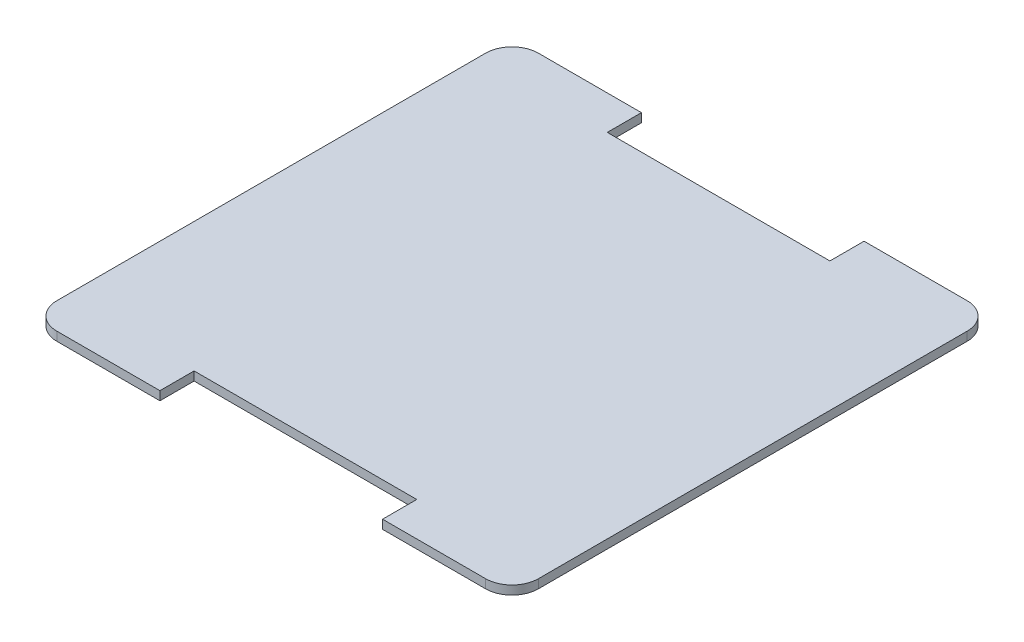
ISO-10303-21;
HEADER;
FILE_DESCRIPTION(('STEP AP214'),'2;1');
FILE_NAME('part.step','',(''),(''),'','','');
FILE_SCHEMA(('AUTOMOTIVE_DESIGN { 1 0 10303 214 1 1 1 1 }'));
ENDSEC;
DATA;
#1=APPLICATION_CONTEXT('core data for automotive mechanical design processes');
#2=APPLICATION_PROTOCOL_DEFINITION('international standard','automotive_design',2000,#1);
#3=PRODUCT_CONTEXT('',#1,'mechanical');
#4=PRODUCT('Part','Part','',(#3));
#5=PRODUCT_RELATED_PRODUCT_CATEGORY('part','',(#4));
#6=PRODUCT_DEFINITION_FORMATION('','',#4);
#7=PRODUCT_DEFINITION_CONTEXT('part definition',#1,'design');
#8=PRODUCT_DEFINITION('design','',#6,#7);
#9=PRODUCT_DEFINITION_SHAPE('','',#8);
#10=(LENGTH_UNIT() NAMED_UNIT(*) SI_UNIT(.MILLI.,.METRE.));
#11=(NAMED_UNIT(*) PLANE_ANGLE_UNIT() SI_UNIT($,.RADIAN.));
#12=(NAMED_UNIT(*) SI_UNIT($,.STERADIAN.) SOLID_ANGLE_UNIT());
#13=UNCERTAINTY_MEASURE_WITH_UNIT(LENGTH_MEASURE(1.E-05),#10,'distance_accuracy_value','');
#14=(GEOMETRIC_REPRESENTATION_CONTEXT(3) GLOBAL_UNCERTAINTY_ASSIGNED_CONTEXT((#13)) GLOBAL_UNIT_ASSIGNED_CONTEXT((#10,
#11,#12)) REPRESENTATION_CONTEXT('',''));
#15=CARTESIAN_POINT('',(0.,0.,0.));
#16=DIRECTION('',(0.,0.,1.));
#17=DIRECTION('',(1.,0.,0.));
#18=AXIS2_PLACEMENT_3D('',#15,#16,#17);
#19=CARTESIAN_POINT('',(-153.357036721238,58.7071385573017,452.9));
#20=DIRECTION('',(1.,0.,0.));
#21=DIRECTION('',(0.,0.,-1.));
#22=AXIS2_PLACEMENT_3D('',#19,#20,#21);
#23=PLANE('',#22);
#24=DIRECTION('',(0.,0.,1.));
#25=VECTOR('',#24,1.);
#26=CARTESIAN_POINT('',(-153.357036721238,50.7071385573017,452.9));
#27=LINE('',#26,#25);
#28=CARTESIAN_POINT('',(-153.357036721238,50.7071385573017,452.9));
#29=VERTEX_POINT('',#28);
#30=CARTESIAN_POINT('',(-153.357036721238,50.7071385573017,483.995534569727));
#31=VERTEX_POINT('',#30);
#32=EDGE_CURVE('E188',#29,#31,#27,.T.);
#33=ORIENTED_EDGE('',*,*,#32,.F.);
#34=DIRECTION('',(0.,-1.,0.));
#35=VECTOR('',#34,1.);
#36=CARTESIAN_POINT('',(-153.357036721238,58.7071385573017,452.9));
#37=LINE('',#36,#35);
#38=CARTESIAN_POINT('',(-153.357036721238,58.7071385573017,452.9));
#39=VERTEX_POINT('',#38);
#40=EDGE_CURVE('E11',#39,#29,#37,.T.);
#41=ORIENTED_EDGE('',*,*,#40,.F.);
#42=DIRECTION('',(0.,0.,1.));
#43=VECTOR('',#42,1.);
#44=CARTESIAN_POINT('',(-153.357036721238,58.7071385573017,452.9));
#45=LINE('',#44,#43);
#46=CARTESIAN_POINT('',(-153.357036721238,58.7071385573017,483.995534569727));
#47=VERTEX_POINT('',#46);
#48=EDGE_CURVE('E230',#39,#47,#45,.T.);
#49=ORIENTED_EDGE('',*,*,#48,.T.);
#50=DIRECTION('',(0.,-1.,0.));
#51=VECTOR('',#50,1.);
#52=CARTESIAN_POINT('',(-153.357036721238,58.7071385573017,483.995534569727));
#53=LINE('',#52,#51);
#54=EDGE_CURVE('E45',#47,#31,#53,.T.);
#55=ORIENTED_EDGE('',*,*,#54,.T.);
#56=EDGE_LOOP('',(#33,#41,#49,#55));
#57=FACE_BOUND('',#56,.T.);
#58=ADVANCED_FACE('F42',(#57),#23,.T.);
#59=CARTESIAN_POINT('',(-153.357036721238,58.7071385573017,452.9));
#60=DIRECTION('',(0.,0.,-1.));
#61=DIRECTION('',(-1.,0.,0.));
#62=AXIS2_PLACEMENT_3D('',#59,#60,#61);
#63=PLANE('',#62);
#64=DIRECTION('',(1.,0.,0.));
#65=VECTOR('',#64,1.);
#66=CARTESIAN_POINT('',(-153.357036721238,50.7071385573017,452.9));
#67=LINE('',#66,#65);
#68=CARTESIAN_POINT('',(49.1529632787621,50.7071385573017,452.9));
#69=VERTEX_POINT('',#68);
#70=EDGE_CURVE('E111',#29,#69,#67,.T.);
#71=ORIENTED_EDGE('',*,*,#70,.T.);
#72=DIRECTION('',(0.,-1.,0.));
#73=VECTOR('',#72,1.);
#74=CARTESIAN_POINT('',(49.1529632787621,58.7071385573017,452.9));
#75=LINE('',#74,#73);
#76=CARTESIAN_POINT('',(49.1529632787621,58.7071385573017,452.9));
#77=VERTEX_POINT('',#76);
#78=EDGE_CURVE('E51',#77,#69,#75,.T.);
#79=ORIENTED_EDGE('',*,*,#78,.F.);
#80=DIRECTION('',(1.,0.,0.));
#81=VECTOR('',#80,1.);
#82=CARTESIAN_POINT('',(-153.357036721238,58.7071385573017,452.9));
#83=LINE('',#82,#81);
#84=EDGE_CURVE('E166',#39,#77,#83,.T.);
#85=ORIENTED_EDGE('',*,*,#84,.F.);
#86=ORIENTED_EDGE('',*,*,#40,.T.);
#87=EDGE_LOOP('',(#71,#79,#85,#86));
#88=FACE_BOUND('',#87,.T.);
#89=ADVANCED_FACE('F341',(#88),#63,.F.);
#90=CARTESIAN_POINT('',(49.1529632787621,58.7071385573017,452.9));
#91=DIRECTION('',(1.,0.,0.));
#92=DIRECTION('',(0.,0.,-1.));
#93=AXIS2_PLACEMENT_3D('',#90,#91,#92);
#94=PLANE('',#93);
#95=DIRECTION('',(0.,0.,1.));
#96=VECTOR('',#95,1.);
#97=CARTESIAN_POINT('',(49.1529632787621,50.7071385573017,452.9));
#98=LINE('',#97,#96);
#99=CARTESIAN_POINT('',(49.1529632787622,50.7071385573017,483.995534569727));
#100=VERTEX_POINT('',#99);
#101=EDGE_CURVE('E173',#69,#100,#98,.T.);
#102=ORIENTED_EDGE('',*,*,#101,.T.);
#103=DIRECTION('',(0.,-1.,0.));
#104=VECTOR('',#103,1.);
#105=CARTESIAN_POINT('',(49.1529632787622,58.7071385573017,483.995534569727));
#106=LINE('',#105,#104);
#107=CARTESIAN_POINT('',(49.1529632787622,58.7071385573017,483.995534569727));
#108=VERTEX_POINT('',#107);
#109=EDGE_CURVE('E170',#108,#100,#106,.T.);
#110=ORIENTED_EDGE('',*,*,#109,.F.);
#111=DIRECTION('',(0.,0.,1.));
#112=VECTOR('',#111,1.);
#113=CARTESIAN_POINT('',(49.1529632787621,58.7071385573017,452.9));
#114=LINE('',#113,#112);
#115=EDGE_CURVE('E160',#77,#108,#114,.T.);
#116=ORIENTED_EDGE('',*,*,#115,.F.);
#117=ORIENTED_EDGE('',*,*,#78,.T.);
#118=EDGE_LOOP('',(#102,#110,#116,#117));
#119=FACE_BOUND('',#118,.T.);
#120=ADVANCED_FACE('F171',(#119),#94,.F.);
#121=CARTESIAN_POINT('',(142.897963278762,58.7071385573017,483.995534569727));
#122=DIRECTION('',(0.,0.,1.));
#123=DIRECTION('',(1.,0.,0.));
#124=AXIS2_PLACEMENT_3D('',#121,#122,#123);
#125=PLANE('',#124);
#126=DIRECTION('',(-1.,0.,0.));
#127=VECTOR('',#126,1.);
#128=CARTESIAN_POINT('',(142.897963278762,50.7071385573017,483.995534569727));
#129=LINE('',#128,#127);
#130=CARTESIAN_POINT('',(142.897963278762,50.7071385573017,483.995534569727));
#131=VERTEX_POINT('',#130);
#132=EDGE_CURVE('E227',#131,#100,#129,.T.);
#133=ORIENTED_EDGE('',*,*,#132,.F.);
#134=DIRECTION('',(0.,-1.,0.));
#135=VECTOR('',#134,1.);
#136=CARTESIAN_POINT('',(142.897963278762,58.7071385573017,483.995534569727));
#137=LINE('',#136,#135);
#138=CARTESIAN_POINT('',(142.897963278762,58.7071385573017,483.995534569727));
#139=VERTEX_POINT('',#138);
#140=EDGE_CURVE('E177',#139,#131,#137,.T.);
#141=ORIENTED_EDGE('',*,*,#140,.F.);
#142=DIRECTION('',(-1.,0.,0.));
#143=VECTOR('',#142,1.);
#144=CARTESIAN_POINT('',(142.897963278762,58.7071385573017,483.995534569727));
#145=LINE('',#144,#143);
#146=EDGE_CURVE('E165',#139,#108,#145,.T.);
#147=ORIENTED_EDGE('',*,*,#146,.T.);
#148=ORIENTED_EDGE('',*,*,#109,.T.);
#149=EDGE_LOOP('',(#133,#141,#147,#148));
#150=FACE_BOUND('',#149,.T.);
#151=ADVANCED_FACE('F179',(#150),#125,.T.);
#152=CARTESIAN_POINT('',(142.897963278762,58.7071385573017,460.));
#153=DIRECTION('',(0.,-1.,0.));
#154=DIRECTION('',(0.,0.,-1.));
#155=AXIS2_PLACEMENT_3D('',#152,#153,#154);
#156=CYLINDRICAL_SURFACE('',#155,23.9955345697272);
#157=CARTESIAN_POINT('',(142.897963278762,50.7071385573017,460.));
#158=DIRECTION('',(0.,1.,0.));
#159=DIRECTION('',(0.,0.,1.));
#160=AXIS2_PLACEMENT_3D('',#157,#158,#159);
#161=CIRCLE('',#160,23.9955345697272);
#162=CARTESIAN_POINT('',(166.893497848489,50.7071385573017,460.));
#163=VERTEX_POINT('',#162);
#164=EDGE_CURVE('E224',#131,#163,#161,.T.);
#165=ORIENTED_EDGE('',*,*,#164,.T.);
#166=DIRECTION('',(0.,-1.,0.));
#167=VECTOR('',#166,1.);
#168=CARTESIAN_POINT('',(166.893497848489,58.7071385573017,460.));
#169=LINE('',#168,#167);
#170=CARTESIAN_POINT('',(166.893497848489,58.7071385573017,460.));
#171=VERTEX_POINT('',#170);
#172=EDGE_CURVE('E234',#171,#163,#169,.T.);
#173=ORIENTED_EDGE('',*,*,#172,.F.);
#174=CARTESIAN_POINT('',(142.897963278762,58.7071385573017,460.));
#175=DIRECTION('',(0.,1.,0.));
#176=DIRECTION('',(0.,0.,1.));
#177=AXIS2_PLACEMENT_3D('',#174,#175,#176);
#178=CIRCLE('',#177,23.9955345697272);
#179=EDGE_CURVE('E181',#139,#171,#178,.T.);
#180=ORIENTED_EDGE('',*,*,#179,.F.);
#181=ORIENTED_EDGE('',*,*,#140,.T.);
#182=EDGE_LOOP('',(#165,#173,#180,#181));
#183=FACE_BOUND('',#182,.T.);
#184=ADVANCED_FACE('F264',(#183),#156,.T.);
#185=CARTESIAN_POINT('',(166.893497848489,58.7071385573017,70.));
#186=DIRECTION('',(1.,0.,0.));
#187=DIRECTION('',(0.,0.,-1.));
#188=AXIS2_PLACEMENT_3D('',#185,#186,#187);
#189=PLANE('',#188);
#190=DIRECTION('',(0.,0.,1.));
#191=VECTOR('',#190,1.);
#192=CARTESIAN_POINT('',(166.893497848489,50.7071385573017,70.));
#193=LINE('',#192,#191);
#194=CARTESIAN_POINT('',(166.893497848489,50.7071385573017,70.));
#195=VERTEX_POINT('',#194);
#196=EDGE_CURVE('E221',#195,#163,#193,.T.);
#197=ORIENTED_EDGE('',*,*,#196,.F.);
#198=DIRECTION('',(0.,-1.,0.));
#199=VECTOR('',#198,1.);
#200=CARTESIAN_POINT('',(166.893497848489,58.7071385573017,70.));
#201=LINE('',#200,#199);
#202=CARTESIAN_POINT('',(166.893497848489,58.7071385573017,70.));
#203=VERTEX_POINT('',#202);
#204=EDGE_CURVE('E236',#203,#195,#201,.T.);
#205=ORIENTED_EDGE('',*,*,#204,.F.);
#206=DIRECTION('',(0.,0.,1.));
#207=VECTOR('',#206,1.);
#208=CARTESIAN_POINT('',(166.893497848489,58.7071385573017,70.));
#209=LINE('',#208,#207);
#210=EDGE_CURVE('E183',#203,#171,#209,.T.);
#211=ORIENTED_EDGE('',*,*,#210,.T.);
#212=ORIENTED_EDGE('',*,*,#172,.T.);
#213=EDGE_LOOP('',(#197,#205,#211,#212));
#214=FACE_BOUND('',#213,.T.);
#215=ADVANCED_FACE('F331',(#214),#189,.T.);
#216=CARTESIAN_POINT('',(142.897963278762,58.7071385573017,70.));
#217=DIRECTION('',(0.,-1.,0.));
#218=DIRECTION('',(0.,0.,-1.));
#219=AXIS2_PLACEMENT_3D('',#216,#217,#218);
#220=CYLINDRICAL_SURFACE('',#219,23.9955345697272);
#221=CARTESIAN_POINT('',(142.897963278762,50.7071385573017,70.));
#222=DIRECTION('',(0.,1.,0.));
#223=DIRECTION('',(0.,0.,1.));
#224=AXIS2_PLACEMENT_3D('',#221,#222,#223);
#225=CIRCLE('',#224,23.9955345697272);
#226=CARTESIAN_POINT('',(142.897963278762,50.7071385573017,46.0044654302729));
#227=VERTEX_POINT('',#226);
#228=EDGE_CURVE('E218',#195,#227,#225,.T.);
#229=ORIENTED_EDGE('',*,*,#228,.T.);
#230=DIRECTION('',(0.,-1.,0.));
#231=VECTOR('',#230,1.);
#232=CARTESIAN_POINT('',(142.897963278762,58.7071385573017,46.0044654302729));
#233=LINE('',#232,#231);
#234=CARTESIAN_POINT('',(142.897963278762,58.7071385573017,46.0044654302729));
#235=VERTEX_POINT('',#234);
#236=EDGE_CURVE('E238',#235,#227,#233,.T.);
#237=ORIENTED_EDGE('',*,*,#236,.F.);
#238=CARTESIAN_POINT('',(142.897963278762,58.7071385573017,70.));
#239=DIRECTION('',(0.,1.,0.));
#240=DIRECTION('',(0.,0.,1.));
#241=AXIS2_PLACEMENT_3D('',#238,#239,#240);
#242=CIRCLE('',#241,23.9955345697272);
#243=EDGE_CURVE('E269',#203,#235,#242,.T.);
#244=ORIENTED_EDGE('',*,*,#243,.F.);
#245=ORIENTED_EDGE('',*,*,#204,.T.);
#246=EDGE_LOOP('',(#229,#237,#244,#245));
#247=FACE_BOUND('',#246,.T.);
#248=ADVANCED_FACE('F330',(#247),#220,.T.);
#249=CARTESIAN_POINT('',(49.1529632787621,58.7071385573017,46.0044654302729));
#250=DIRECTION('',(0.,0.,-1.));
#251=DIRECTION('',(-1.,0.,0.));
#252=AXIS2_PLACEMENT_3D('',#249,#250,#251);
#253=PLANE('',#252);
#254=DIRECTION('',(1.,0.,0.));
#255=VECTOR('',#254,1.);
#256=CARTESIAN_POINT('',(49.1529632787621,50.7071385573017,46.0044654302729));
#257=LINE('',#256,#255);
#258=CARTESIAN_POINT('',(49.1529632787621,50.7071385573017,46.0044654302729));
#259=VERTEX_POINT('',#258);
#260=EDGE_CURVE('E215',#259,#227,#257,.T.);
#261=ORIENTED_EDGE('',*,*,#260,.F.);
#262=DIRECTION('',(0.,-1.,0.));
#263=VECTOR('',#262,1.);
#264=CARTESIAN_POINT('',(49.1529632787621,58.7071385573017,46.0044654302729));
#265=LINE('',#264,#263);
#266=CARTESIAN_POINT('',(49.1529632787621,58.7071385573017,46.0044654302729));
#267=VERTEX_POINT('',#266);
#268=EDGE_CURVE('E240',#267,#259,#265,.T.);
#269=ORIENTED_EDGE('',*,*,#268,.F.);
#270=DIRECTION('',(1.,0.,0.));
#271=VECTOR('',#270,1.);
#272=CARTESIAN_POINT('',(49.1529632787621,58.7071385573017,46.0044654302729));
#273=LINE('',#272,#271);
#274=EDGE_CURVE('E272',#267,#235,#273,.T.);
#275=ORIENTED_EDGE('',*,*,#274,.T.);
#276=ORIENTED_EDGE('',*,*,#236,.T.);
#277=EDGE_LOOP('',(#261,#269,#275,#276));
#278=FACE_BOUND('',#277,.T.);
#279=ADVANCED_FACE('F328',(#278),#253,.T.);
#280=CARTESIAN_POINT('',(49.1529632787621,58.7071385573017,77.1));
#281=DIRECTION('',(-1.,0.,0.));
#282=DIRECTION('',(0.,0.,1.));
#283=AXIS2_PLACEMENT_3D('',#280,#281,#282);
#284=PLANE('',#283);
#285=DIRECTION('',(0.,0.,-1.));
#286=VECTOR('',#285,1.);
#287=CARTESIAN_POINT('',(49.1529632787621,50.7071385573017,77.1));
#288=LINE('',#287,#286);
#289=CARTESIAN_POINT('',(49.1529632787621,50.7071385573017,77.1));
#290=VERTEX_POINT('',#289);
#291=EDGE_CURVE('E212',#290,#259,#288,.T.);
#292=ORIENTED_EDGE('',*,*,#291,.F.);
#293=DIRECTION('',(0.,-1.,0.));
#294=VECTOR('',#293,1.);
#295=CARTESIAN_POINT('',(49.1529632787621,58.7071385573017,77.1));
#296=LINE('',#295,#294);
#297=CARTESIAN_POINT('',(49.1529632787621,58.7071385573017,77.1));
#298=VERTEX_POINT('',#297);
#299=EDGE_CURVE('E242',#298,#290,#296,.T.);
#300=ORIENTED_EDGE('',*,*,#299,.F.);
#301=DIRECTION('',(0.,0.,-1.));
#302=VECTOR('',#301,1.);
#303=CARTESIAN_POINT('',(49.1529632787621,58.7071385573017,77.1));
#304=LINE('',#303,#302);
#305=EDGE_CURVE('E277',#298,#267,#304,.T.);
#306=ORIENTED_EDGE('',*,*,#305,.T.);
#307=ORIENTED_EDGE('',*,*,#268,.T.);
#308=EDGE_LOOP('',(#292,#300,#306,#307));
#309=FACE_BOUND('',#308,.T.);
#310=ADVANCED_FACE('F325',(#309),#284,.T.);
#311=CARTESIAN_POINT('',(-153.357036721238,58.7071385573017,77.1));
#312=DIRECTION('',(0.,0.,-1.));
#313=DIRECTION('',(-1.,0.,0.));
#314=AXIS2_PLACEMENT_3D('',#311,#312,#313);
#315=PLANE('',#314);
#316=DIRECTION('',(1.,0.,0.));
#317=VECTOR('',#316,1.);
#318=CARTESIAN_POINT('',(-153.357036721238,50.7071385573017,77.1));
#319=LINE('',#318,#317);
#320=CARTESIAN_POINT('',(-153.357036721238,50.7071385573017,77.1));
#321=VERTEX_POINT('',#320);
#322=EDGE_CURVE('E209',#321,#290,#319,.T.);
#323=ORIENTED_EDGE('',*,*,#322,.F.);
#324=DIRECTION('',(0.,-1.,0.));
#325=VECTOR('',#324,1.);
#326=CARTESIAN_POINT('',(-153.357036721238,58.7071385573017,77.1));
#327=LINE('',#326,#325);
#328=CARTESIAN_POINT('',(-153.357036721238,58.7071385573017,77.1));
#329=VERTEX_POINT('',#328);
#330=EDGE_CURVE('E244',#329,#321,#327,.T.);
#331=ORIENTED_EDGE('',*,*,#330,.F.);
#332=DIRECTION('',(1.,0.,0.));
#333=VECTOR('',#332,1.);
#334=CARTESIAN_POINT('',(-153.357036721238,58.7071385573017,77.1));
#335=LINE('',#334,#333);
#336=EDGE_CURVE('E280',#329,#298,#335,.T.);
#337=ORIENTED_EDGE('',*,*,#336,.T.);
#338=ORIENTED_EDGE('',*,*,#299,.T.);
#339=EDGE_LOOP('',(#323,#331,#337,#338));
#340=FACE_BOUND('',#339,.T.);
#341=ADVANCED_FACE('F320',(#340),#315,.T.);
#342=CARTESIAN_POINT('',(-153.357036721238,58.7071385573017,77.1));
#343=DIRECTION('',(-1.,0.,0.));
#344=DIRECTION('',(0.,0.,1.));
#345=AXIS2_PLACEMENT_3D('',#342,#343,#344);
#346=PLANE('',#345);
#347=DIRECTION('',(0.,0.,-1.));
#348=VECTOR('',#347,1.);
#349=CARTESIAN_POINT('',(-153.357036721238,50.7071385573017,77.1));
#350=LINE('',#349,#348);
#351=CARTESIAN_POINT('',(-153.357036721238,50.7071385573017,46.0044654302728));
#352=VERTEX_POINT('',#351);
#353=EDGE_CURVE('E206',#321,#352,#350,.T.);
#354=ORIENTED_EDGE('',*,*,#353,.T.);
#355=DIRECTION('',(0.,-1.,0.));
#356=VECTOR('',#355,1.);
#357=CARTESIAN_POINT('',(-153.357036721238,58.7071385573017,46.0044654302728));
#358=LINE('',#357,#356);
#359=CARTESIAN_POINT('',(-153.357036721238,58.7071385573017,46.0044654302728));
#360=VERTEX_POINT('',#359);
#361=EDGE_CURVE('E246',#360,#352,#358,.T.);
#362=ORIENTED_EDGE('',*,*,#361,.F.);
#363=DIRECTION('',(0.,0.,-1.));
#364=VECTOR('',#363,1.);
#365=CARTESIAN_POINT('',(-153.357036721238,58.7071385573017,77.1));
#366=LINE('',#365,#364);
#367=EDGE_CURVE('E283',#329,#360,#366,.T.);
#368=ORIENTED_EDGE('',*,*,#367,.F.);
#369=ORIENTED_EDGE('',*,*,#330,.T.);
#370=EDGE_LOOP('',(#354,#362,#368,#369));
#371=FACE_BOUND('',#370,.T.);
#372=ADVANCED_FACE('F317',(#371),#346,.F.);
#373=CARTESIAN_POINT('',(-247.102036721238,58.7071385573017,46.0044654302729));
#374=DIRECTION('',(0.,0.,-1.));
#375=DIRECTION('',(-1.,0.,0.));
#376=AXIS2_PLACEMENT_3D('',#373,#374,#375);
#377=PLANE('',#376);
#378=DIRECTION('',(1.,0.,0.));
#379=VECTOR('',#378,1.);
#380=CARTESIAN_POINT('',(-247.102036721238,50.7071385573017,46.0044654302729));
#381=LINE('',#380,#379);
#382=CARTESIAN_POINT('',(-247.102036721238,50.7071385573017,46.0044654302729));
#383=VERTEX_POINT('',#382);
#384=EDGE_CURVE('E203',#383,#352,#381,.T.);
#385=ORIENTED_EDGE('',*,*,#384,.F.);
#386=DIRECTION('',(0.,-1.,0.));
#387=VECTOR('',#386,1.);
#388=CARTESIAN_POINT('',(-247.102036721238,58.7071385573017,46.0044654302729));
#389=LINE('',#388,#387);
#390=CARTESIAN_POINT('',(-247.102036721238,58.7071385573017,46.0044654302729));
#391=VERTEX_POINT('',#390);
#392=EDGE_CURVE('E248',#391,#383,#389,.T.);
#393=ORIENTED_EDGE('',*,*,#392,.F.);
#394=DIRECTION('',(1.,0.,0.));
#395=VECTOR('',#394,1.);
#396=CARTESIAN_POINT('',(-247.102036721238,58.7071385573017,46.0044654302729));
#397=LINE('',#396,#395);
#398=EDGE_CURVE('E285',#391,#360,#397,.T.);
#399=ORIENTED_EDGE('',*,*,#398,.T.);
#400=ORIENTED_EDGE('',*,*,#361,.T.);
#401=EDGE_LOOP('',(#385,#393,#399,#400));
#402=FACE_BOUND('',#401,.T.);
#403=ADVANCED_FACE('F312',(#402),#377,.T.);
#404=CARTESIAN_POINT('',(-247.102036721238,58.7071385573017,70.));
#405=DIRECTION('',(0.,-1.,0.));
#406=DIRECTION('',(0.,0.,-1.));
#407=AXIS2_PLACEMENT_3D('',#404,#405,#406);
#408=CYLINDRICAL_SURFACE('',#407,23.9955345697271);
#409=CARTESIAN_POINT('',(-247.102036721238,50.7071385573017,70.));
#410=DIRECTION('',(0.,1.,0.));
#411=DIRECTION('',(0.,0.,1.));
#412=AXIS2_PLACEMENT_3D('',#409,#410,#411);
#413=CIRCLE('',#412,23.9955345697271);
#414=CARTESIAN_POINT('',(-271.097571290965,50.7071385573017,70.));
#415=VERTEX_POINT('',#414);
#416=EDGE_CURVE('E200',#383,#415,#413,.T.);
#417=ORIENTED_EDGE('',*,*,#416,.T.);
#418=DIRECTION('',(0.,-1.,0.));
#419=VECTOR('',#418,1.);
#420=CARTESIAN_POINT('',(-271.097571290965,58.7071385573017,70.));
#421=LINE('',#420,#419);
#422=CARTESIAN_POINT('',(-271.097571290965,58.7071385573017,70.));
#423=VERTEX_POINT('',#422);
#424=EDGE_CURVE('E250',#423,#415,#421,.T.);
#425=ORIENTED_EDGE('',*,*,#424,.F.);
#426=CARTESIAN_POINT('',(-247.102036721238,58.7071385573017,70.));
#427=DIRECTION('',(0.,1.,0.));
#428=DIRECTION('',(0.,0.,1.));
#429=AXIS2_PLACEMENT_3D('',#426,#427,#428);
#430=CIRCLE('',#429,23.9955345697271);
#431=EDGE_CURVE('E288',#391,#423,#430,.T.);
#432=ORIENTED_EDGE('',*,*,#431,.F.);
#433=ORIENTED_EDGE('',*,*,#392,.T.);
#434=EDGE_LOOP('',(#417,#425,#432,#433));
#435=FACE_BOUND('',#434,.T.);
#436=ADVANCED_FACE('F308',(#435),#408,.T.);
#437=CARTESIAN_POINT('',(-271.097571290965,58.7071385573017,460.));
#438=DIRECTION('',(-1.,0.,0.));
#439=DIRECTION('',(0.,0.,1.));
#440=AXIS2_PLACEMENT_3D('',#437,#438,#439);
#441=PLANE('',#440);
#442=DIRECTION('',(0.,0.,-1.));
#443=VECTOR('',#442,1.);
#444=CARTESIAN_POINT('',(-271.097571290965,50.7071385573017,460.));
#445=LINE('',#444,#443);
#446=CARTESIAN_POINT('',(-271.097571290965,50.7071385573017,460.));
#447=VERTEX_POINT('',#446);
#448=EDGE_CURVE('E197',#447,#415,#445,.T.);
#449=ORIENTED_EDGE('',*,*,#448,.F.);
#450=DIRECTION('',(0.,-1.,0.));
#451=VECTOR('',#450,1.);
#452=CARTESIAN_POINT('',(-271.097571290965,58.7071385573017,460.));
#453=LINE('',#452,#451);
#454=CARTESIAN_POINT('',(-271.097571290965,58.7071385573017,460.));
#455=VERTEX_POINT('',#454);
#456=EDGE_CURVE('E252',#455,#447,#453,.T.);
#457=ORIENTED_EDGE('',*,*,#456,.F.);
#458=DIRECTION('',(0.,0.,-1.));
#459=VECTOR('',#458,1.);
#460=CARTESIAN_POINT('',(-271.097571290965,58.7071385573017,460.));
#461=LINE('',#460,#459);
#462=EDGE_CURVE('E290',#455,#423,#461,.T.);
#463=ORIENTED_EDGE('',*,*,#462,.T.);
#464=ORIENTED_EDGE('',*,*,#424,.T.);
#465=EDGE_LOOP('',(#449,#457,#463,#464));
#466=FACE_BOUND('',#465,.T.);
#467=ADVANCED_FACE('F304',(#466),#441,.T.);
#468=CARTESIAN_POINT('',(-247.102036721238,58.7071385573017,460.));
#469=DIRECTION('',(0.,-1.,0.));
#470=DIRECTION('',(0.,0.,-1.));
#471=AXIS2_PLACEMENT_3D('',#468,#469,#470);
#472=CYLINDRICAL_SURFACE('',#471,23.9955345697271);
#473=CARTESIAN_POINT('',(-247.102036721238,50.7071385573017,460.));
#474=DIRECTION('',(0.,1.,0.));
#475=DIRECTION('',(0.,0.,1.));
#476=AXIS2_PLACEMENT_3D('',#473,#474,#475);
#477=CIRCLE('',#476,23.9955345697271);
#478=CARTESIAN_POINT('',(-247.102036721238,50.7071385573017,483.995534569727));
#479=VERTEX_POINT('',#478);
#480=EDGE_CURVE('E194',#447,#479,#477,.T.);
#481=ORIENTED_EDGE('',*,*,#480,.T.);
#482=DIRECTION('',(0.,-1.,0.));
#483=VECTOR('',#482,1.);
#484=CARTESIAN_POINT('',(-247.102036721238,58.7071385573017,483.995534569727));
#485=LINE('',#484,#483);
#486=CARTESIAN_POINT('',(-247.102036721238,58.7071385573017,483.995534569727));
#487=VERTEX_POINT('',#486);
#488=EDGE_CURVE('E253',#487,#479,#485,.T.);
#489=ORIENTED_EDGE('',*,*,#488,.F.);
#490=CARTESIAN_POINT('',(-247.102036721238,58.7071385573017,460.));
#491=DIRECTION('',(0.,1.,0.));
#492=DIRECTION('',(0.,0.,1.));
#493=AXIS2_PLACEMENT_3D('',#490,#491,#492);
#494=CIRCLE('',#493,23.9955345697271);
#495=EDGE_CURVE('E293',#455,#487,#494,.T.);
#496=ORIENTED_EDGE('',*,*,#495,.F.);
#497=ORIENTED_EDGE('',*,*,#456,.T.);
#498=EDGE_LOOP('',(#481,#489,#496,#497));
#499=FACE_BOUND('',#498,.T.);
#500=ADVANCED_FACE('F300',(#499),#472,.T.);
#501=CARTESIAN_POINT('',(-153.357036721238,58.7071385573017,483.995534569727));
#502=DIRECTION('',(0.,0.,1.));
#503=DIRECTION('',(1.,0.,0.));
#504=AXIS2_PLACEMENT_3D('',#501,#502,#503);
#505=PLANE('',#504);
#506=DIRECTION('',(-1.,0.,0.));
#507=VECTOR('',#506,1.);
#508=CARTESIAN_POINT('',(-153.357036721238,50.7071385573017,483.995534569727));
#509=LINE('',#508,#507);
#510=EDGE_CURVE('E191',#31,#479,#509,.T.);
#511=ORIENTED_EDGE('',*,*,#510,.F.);
#512=ORIENTED_EDGE('',*,*,#54,.F.);
#513=DIRECTION('',(-1.,0.,0.));
#514=VECTOR('',#513,1.);
#515=CARTESIAN_POINT('',(-153.357036721238,58.7071385573017,483.995534569727));
#516=LINE('',#515,#514);
#517=EDGE_CURVE('E295',#47,#487,#516,.T.);
#518=ORIENTED_EDGE('',*,*,#517,.T.);
#519=ORIENTED_EDGE('',*,*,#488,.T.);
#520=EDGE_LOOP('',(#511,#512,#518,#519));
#521=FACE_BOUND('',#520,.T.);
#522=ADVANCED_FACE('F255',(#521),#505,.T.);
#523=CARTESIAN_POINT('',(-247.102036721238,58.7071385573017,460.));
#524=DIRECTION('',(0.,1.,0.));
#525=DIRECTION('',(0.,0.,1.));
#526=AXIS2_PLACEMENT_3D('',#523,#524,#525);
#527=PLANE('',#526);
#528=ORIENTED_EDGE('',*,*,#48,.F.);
#529=ORIENTED_EDGE('',*,*,#84,.T.);
#530=ORIENTED_EDGE('',*,*,#115,.T.);
#531=ORIENTED_EDGE('',*,*,#146,.F.);
#532=ORIENTED_EDGE('',*,*,#179,.T.);
#533=ORIENTED_EDGE('',*,*,#210,.F.);
#534=ORIENTED_EDGE('',*,*,#243,.T.);
#535=ORIENTED_EDGE('',*,*,#274,.F.);
#536=ORIENTED_EDGE('',*,*,#305,.F.);
#537=ORIENTED_EDGE('',*,*,#336,.F.);
#538=ORIENTED_EDGE('',*,*,#367,.T.);
#539=ORIENTED_EDGE('',*,*,#398,.F.);
#540=ORIENTED_EDGE('',*,*,#431,.T.);
#541=ORIENTED_EDGE('',*,*,#462,.F.);
#542=ORIENTED_EDGE('',*,*,#495,.T.);
#543=ORIENTED_EDGE('',*,*,#517,.F.);
#544=EDGE_LOOP('',(#528,#529,#530,#531,#532,#533,#534,#535,#536,#537,#538,#539,#540,#541,#542,#543));
#545=FACE_BOUND('',#544,.T.);
#546=ADVANCED_FACE('F163',(#545),#527,.T.);
#547=CARTESIAN_POINT('',(-247.102036721238,50.7071385573017,460.));
#548=DIRECTION('',(0.,1.,0.));
#549=DIRECTION('',(0.,0.,1.));
#550=AXIS2_PLACEMENT_3D('',#547,#548,#549);
#551=PLANE('',#550);
#552=ORIENTED_EDGE('',*,*,#32,.T.);
#553=ORIENTED_EDGE('',*,*,#510,.T.);
#554=ORIENTED_EDGE('',*,*,#480,.F.);
#555=ORIENTED_EDGE('',*,*,#448,.T.);
#556=ORIENTED_EDGE('',*,*,#416,.F.);
#557=ORIENTED_EDGE('',*,*,#384,.T.);
#558=ORIENTED_EDGE('',*,*,#353,.F.);
#559=ORIENTED_EDGE('',*,*,#322,.T.);
#560=ORIENTED_EDGE('',*,*,#291,.T.);
#561=ORIENTED_EDGE('',*,*,#260,.T.);
#562=ORIENTED_EDGE('',*,*,#228,.F.);
#563=ORIENTED_EDGE('',*,*,#196,.T.);
#564=ORIENTED_EDGE('',*,*,#164,.F.);
#565=ORIENTED_EDGE('',*,*,#132,.T.);
#566=ORIENTED_EDGE('',*,*,#101,.F.);
#567=ORIENTED_EDGE('',*,*,#70,.F.);
#568=EDGE_LOOP('',(#552,#553,#554,#555,#556,#557,#558,#559,#560,#561,#562,#563,#564,#565,#566,#567));
#569=FACE_BOUND('',#568,.T.);
#570=ADVANCED_FACE('F258',(#569),#551,.F.);
#571=CLOSED_SHELL('',(#58,#89,#120,#151,#184,#215,#248,#279,#310,#341,#372,#403,#436,#467,#500,
#522,#546,#570));
#572=MANIFOLD_SOLID_BREP('B2',#571);
#573=ADVANCED_BREP_SHAPE_REPRESENTATION('',(#18,#572),#14);
#574=SHAPE_DEFINITION_REPRESENTATION(#9,#573);
ENDSEC;
END-ISO-10303-21;
